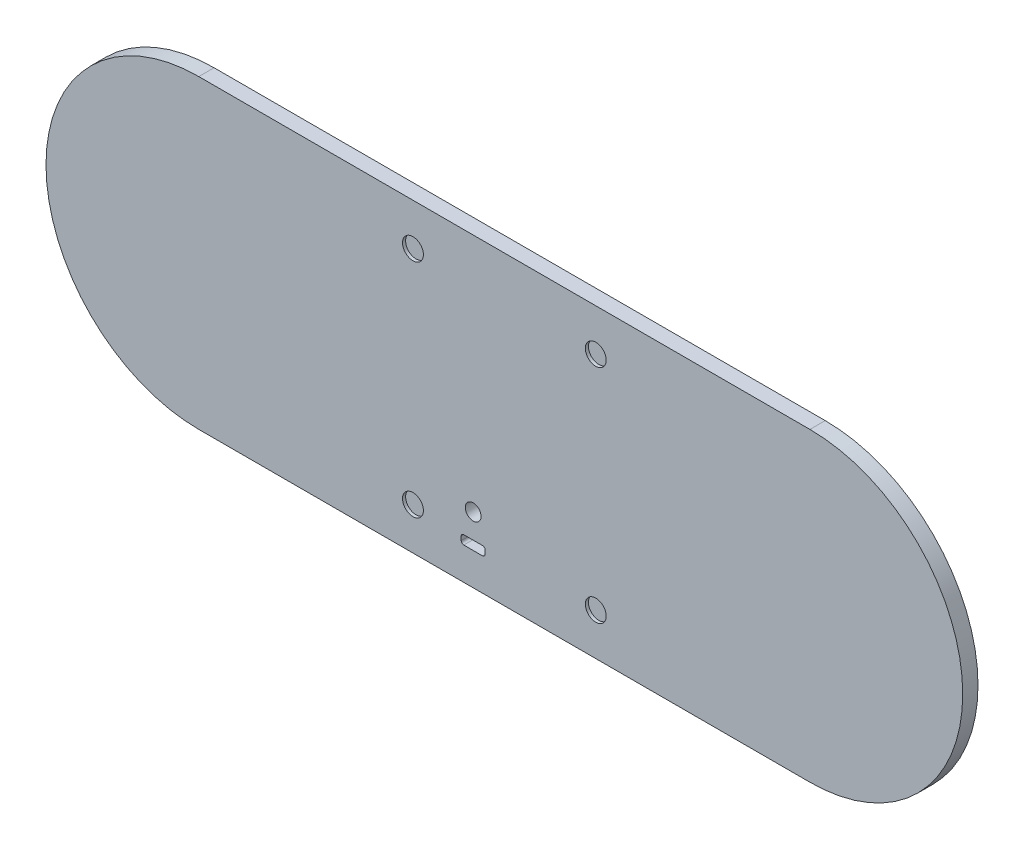
ISO-10303-21;
HEADER;
FILE_DESCRIPTION(('STEP AP214'),'2;1');
FILE_NAME('part.step','',(''),(''),'','','');
FILE_SCHEMA(('AUTOMOTIVE_DESIGN { 1 0 10303 214 1 1 1 1 }'));
ENDSEC;
DATA;
#1=APPLICATION_CONTEXT('core data for automotive mechanical design processes');
#2=APPLICATION_PROTOCOL_DEFINITION('international standard','automotive_design',2000,#1);
#3=PRODUCT_CONTEXT('',#1,'mechanical');
#4=PRODUCT('Part','Part','',(#3));
#5=PRODUCT_RELATED_PRODUCT_CATEGORY('part','',(#4));
#6=PRODUCT_DEFINITION_FORMATION('','',#4);
#7=PRODUCT_DEFINITION_CONTEXT('part definition',#1,'design');
#8=PRODUCT_DEFINITION('design','',#6,#7);
#9=PRODUCT_DEFINITION_SHAPE('','',#8);
#10=(LENGTH_UNIT() NAMED_UNIT(*) SI_UNIT(.MILLI.,.METRE.));
#11=(NAMED_UNIT(*) PLANE_ANGLE_UNIT() SI_UNIT($,.RADIAN.));
#12=(NAMED_UNIT(*) SI_UNIT($,.STERADIAN.) SOLID_ANGLE_UNIT());
#13=UNCERTAINTY_MEASURE_WITH_UNIT(LENGTH_MEASURE(1.E-05),#10,'distance_accuracy_value','');
#14=(GEOMETRIC_REPRESENTATION_CONTEXT(3) GLOBAL_UNCERTAINTY_ASSIGNED_CONTEXT((#13)) GLOBAL_UNIT_ASSIGNED_CONTEXT((#10,
#11,#12)) REPRESENTATION_CONTEXT('',''));
#15=CARTESIAN_POINT('',(0.,0.,0.));
#16=DIRECTION('',(0.,0.,1.));
#17=DIRECTION('',(1.,0.,0.));
#18=AXIS2_PLACEMENT_3D('',#15,#16,#17);
#19=CARTESIAN_POINT('',(120.,0.,6.));
#20=DIRECTION('',(0.,0.,-1.));
#21=DIRECTION('',(-1.,0.,0.));
#22=AXIS2_PLACEMENT_3D('',#19,#20,#21);
#23=CYLINDRICAL_SURFACE('',#22,60.);
#24=CARTESIAN_POINT('',(120.,0.,0.));
#25=DIRECTION('',(0.,0.,1.));
#26=DIRECTION('',(1.,0.,0.));
#27=AXIS2_PLACEMENT_3D('',#24,#25,#26);
#28=CIRCLE('',#27,60.);
#29=CARTESIAN_POINT('',(120.,-60.,0.));
#30=VERTEX_POINT('',#29);
#31=CARTESIAN_POINT('',(120.,60.,0.));
#32=VERTEX_POINT('',#31);
#33=EDGE_CURVE('E150',#30,#32,#28,.T.);
#34=ORIENTED_EDGE('',*,*,#33,.T.);
#35=DIRECTION('',(0.,0.,-1.));
#36=VECTOR('',#35,1.);
#37=CARTESIAN_POINT('',(120.,60.,6.));
#38=LINE('',#37,#36);
#39=CARTESIAN_POINT('',(120.,60.,6.));
#40=VERTEX_POINT('',#39);
#41=EDGE_CURVE('E131',#40,#32,#38,.T.);
#42=ORIENTED_EDGE('',*,*,#41,.F.);
#43=CARTESIAN_POINT('',(120.,0.,6.));
#44=DIRECTION('',(0.,0.,1.));
#45=DIRECTION('',(1.,0.,0.));
#46=AXIS2_PLACEMENT_3D('',#43,#44,#45);
#47=CIRCLE('',#46,60.);
#48=CARTESIAN_POINT('',(120.,-60.,6.));
#49=VERTEX_POINT('',#48);
#50=EDGE_CURVE('E138',#49,#40,#47,.T.);
#51=ORIENTED_EDGE('',*,*,#50,.F.);
#52=DIRECTION('',(0.,0.,-1.));
#53=VECTOR('',#52,1.);
#54=CARTESIAN_POINT('',(120.,-60.,6.));
#55=LINE('',#54,#53);
#56=EDGE_CURVE('E288',#49,#30,#55,.T.);
#57=ORIENTED_EDGE('',*,*,#56,.T.);
#58=EDGE_LOOP('',(#34,#42,#51,#57));
#59=FACE_BOUND('',#58,.T.);
#60=ADVANCED_FACE('F38',(#59),#23,.T.);
#61=CARTESIAN_POINT('',(120.,60.,6.));
#62=DIRECTION('',(0.,-1.,0.));
#63=DIRECTION('',(1.,0.,0.));
#64=AXIS2_PLACEMENT_3D('',#61,#62,#63);
#65=PLANE('',#64);
#66=DIRECTION('',(-1.,0.,0.));
#67=VECTOR('',#66,1.);
#68=CARTESIAN_POINT('',(120.,60.,0.));
#69=LINE('',#68,#67);
#70=CARTESIAN_POINT('',(-120.,60.,0.));
#71=VERTEX_POINT('',#70);
#72=EDGE_CURVE('E290',#32,#71,#69,.T.);
#73=ORIENTED_EDGE('',*,*,#72,.T.);
#74=DIRECTION('',(0.,0.,-1.));
#75=VECTOR('',#74,1.);
#76=CARTESIAN_POINT('',(-120.,60.,6.));
#77=LINE('',#76,#75);
#78=CARTESIAN_POINT('',(-120.,60.,6.));
#79=VERTEX_POINT('',#78);
#80=EDGE_CURVE('E134',#79,#71,#77,.T.);
#81=ORIENTED_EDGE('',*,*,#80,.F.);
#82=DIRECTION('',(-1.,0.,0.));
#83=VECTOR('',#82,1.);
#84=CARTESIAN_POINT('',(120.,60.,6.));
#85=LINE('',#84,#83);
#86=EDGE_CURVE('E127',#40,#79,#85,.T.);
#87=ORIENTED_EDGE('',*,*,#86,.F.);
#88=ORIENTED_EDGE('',*,*,#41,.T.);
#89=EDGE_LOOP('',(#73,#81,#87,#88));
#90=FACE_BOUND('',#89,.T.);
#91=ADVANCED_FACE('F129',(#90),#65,.F.);
#92=CARTESIAN_POINT('',(-120.,0.,6.));
#93=DIRECTION('',(0.,0.,-1.));
#94=DIRECTION('',(-1.,0.,0.));
#95=AXIS2_PLACEMENT_3D('',#92,#93,#94);
#96=CYLINDRICAL_SURFACE('',#95,60.);
#97=CARTESIAN_POINT('',(-120.,0.,0.));
#98=DIRECTION('',(0.,0.,1.));
#99=DIRECTION('',(1.,0.,0.));
#100=AXIS2_PLACEMENT_3D('',#97,#98,#99);
#101=CIRCLE('',#100,60.);
#102=CARTESIAN_POINT('',(-120.,-60.,0.));
#103=VERTEX_POINT('',#102);
#104=EDGE_CURVE('E292',#71,#103,#101,.T.);
#105=ORIENTED_EDGE('',*,*,#104,.T.);
#106=DIRECTION('',(0.,0.,-1.));
#107=VECTOR('',#106,1.);
#108=CARTESIAN_POINT('',(-120.,-60.,6.));
#109=LINE('',#108,#107);
#110=CARTESIAN_POINT('',(-120.,-60.,6.));
#111=VERTEX_POINT('',#110);
#112=EDGE_CURVE('E155',#111,#103,#109,.T.);
#113=ORIENTED_EDGE('',*,*,#112,.F.);
#114=CARTESIAN_POINT('',(-120.,0.,6.));
#115=DIRECTION('',(0.,0.,1.));
#116=DIRECTION('',(1.,0.,0.));
#117=AXIS2_PLACEMENT_3D('',#114,#115,#116);
#118=CIRCLE('',#117,60.);
#119=EDGE_CURVE('E137',#79,#111,#118,.T.);
#120=ORIENTED_EDGE('',*,*,#119,.F.);
#121=ORIENTED_EDGE('',*,*,#80,.T.);
#122=EDGE_LOOP('',(#105,#113,#120,#121));
#123=FACE_BOUND('',#122,.T.);
#124=ADVANCED_FACE('F219',(#123),#96,.T.);
#125=CARTESIAN_POINT('',(120.,-60.,6.));
#126=DIRECTION('',(0.,1.,0.));
#127=DIRECTION('',(-1.,0.,0.));
#128=AXIS2_PLACEMENT_3D('',#125,#126,#127);
#129=PLANE('',#128);
#130=DIRECTION('',(1.,0.,0.));
#131=VECTOR('',#130,1.);
#132=CARTESIAN_POINT('',(120.,-60.,0.));
#133=LINE('',#132,#131);
#134=EDGE_CURVE('E147',#103,#30,#133,.T.);
#135=ORIENTED_EDGE('',*,*,#134,.T.);
#136=ORIENTED_EDGE('',*,*,#56,.F.);
#137=DIRECTION('',(1.,0.,0.));
#138=VECTOR('',#137,1.);
#139=CARTESIAN_POINT('',(120.,-60.,6.));
#140=LINE('',#139,#138);
#141=EDGE_CURVE('E143',#111,#49,#140,.T.);
#142=ORIENTED_EDGE('',*,*,#141,.F.);
#143=ORIENTED_EDGE('',*,*,#112,.T.);
#144=EDGE_LOOP('',(#135,#136,#142,#143));
#145=FACE_BOUND('',#144,.T.);
#146=ADVANCED_FACE('F299',(#145),#129,.F.);
#147=CARTESIAN_POINT('',(120.,0.,6.));
#148=DIRECTION('',(0.,0.,1.));
#149=DIRECTION('',(1.,0.,0.));
#150=AXIS2_PLACEMENT_3D('',#147,#148,#149);
#151=PLANE('',#150);
#152=DIRECTION('',(0.,1.,0.));
#153=VECTOR('',#152,1.);
#154=CARTESIAN_POINT('',(-7.55000000000002,-47.29,6.));
#155=LINE('',#154,#153);
#156=CARTESIAN_POINT('',(-7.55000000000002,-46.29,6.));
#157=VERTEX_POINT('',#156);
#158=CARTESIAN_POINT('',(-7.55000000000002,-44.79,6.));
#159=VERTEX_POINT('',#158);
#160=EDGE_CURVE('E245',#157,#159,#155,.T.);
#161=ORIENTED_EDGE('',*,*,#160,.F.);
#162=CARTESIAN_POINT('',(-8.55000000000002,-46.29,6.));
#163=DIRECTION('',(0.,0.,1.));
#164=DIRECTION('',(1.,0.,0.));
#165=AXIS2_PLACEMENT_3D('',#162,#163,#164);
#166=CIRCLE('',#165,1.);
#167=CARTESIAN_POINT('',(-8.55000000000002,-47.29,6.));
#168=VERTEX_POINT('',#167);
#169=EDGE_CURVE('E179',#157,#168,#166,.F.);
#170=ORIENTED_EDGE('',*,*,#169,.T.);
#171=DIRECTION('',(1.,0.,0.));
#172=VECTOR('',#171,1.);
#173=CARTESIAN_POINT('',(-7.55000000000002,-47.29,6.));
#174=LINE('',#173,#172);
#175=CARTESIAN_POINT('',(-15.95,-47.29,6.));
#176=VERTEX_POINT('',#175);
#177=EDGE_CURVE('E201',#176,#168,#174,.T.);
#178=ORIENTED_EDGE('',*,*,#177,.F.);
#179=CARTESIAN_POINT('',(-15.95,-46.29,6.));
#180=DIRECTION('',(0.,0.,1.));
#181=DIRECTION('',(1.,0.,0.));
#182=AXIS2_PLACEMENT_3D('',#179,#180,#181);
#183=CIRCLE('',#182,1.);
#184=CARTESIAN_POINT('',(-16.95,-46.29,6.));
#185=VERTEX_POINT('',#184);
#186=EDGE_CURVE('E175',#176,#185,#183,.F.);
#187=ORIENTED_EDGE('',*,*,#186,.T.);
#188=DIRECTION('',(0.,-1.,0.));
#189=VECTOR('',#188,1.);
#190=CARTESIAN_POINT('',(-16.95,-47.29,6.));
#191=LINE('',#190,#189);
#192=CARTESIAN_POINT('',(-16.95,-44.79,6.));
#193=VERTEX_POINT('',#192);
#194=EDGE_CURVE('E253',#193,#185,#191,.T.);
#195=ORIENTED_EDGE('',*,*,#194,.F.);
#196=CARTESIAN_POINT('',(-15.95,-44.79,6.));
#197=DIRECTION('',(0.,0.,1.));
#198=DIRECTION('',(1.,0.,0.));
#199=AXIS2_PLACEMENT_3D('',#196,#197,#198);
#200=CIRCLE('',#199,1.);
#201=CARTESIAN_POINT('',(-15.95,-43.79,6.));
#202=VERTEX_POINT('',#201);
#203=EDGE_CURVE('E46',#193,#202,#200,.F.);
#204=ORIENTED_EDGE('',*,*,#203,.T.);
#205=DIRECTION('',(-1.,0.,0.));
#206=VECTOR('',#205,1.);
#207=CARTESIAN_POINT('',(-7.55000000000002,-43.79,6.));
#208=LINE('',#207,#206);
#209=CARTESIAN_POINT('',(-8.55000000000002,-43.79,6.));
#210=VERTEX_POINT('',#209);
#211=EDGE_CURVE('E251',#210,#202,#208,.T.);
#212=ORIENTED_EDGE('',*,*,#211,.F.);
#213=CARTESIAN_POINT('',(-8.55000000000002,-44.79,6.));
#214=DIRECTION('',(0.,0.,1.));
#215=DIRECTION('',(1.,0.,0.));
#216=AXIS2_PLACEMENT_3D('',#213,#214,#215);
#217=CIRCLE('',#216,1.);
#218=EDGE_CURVE('E60',#210,#159,#217,.F.);
#219=ORIENTED_EDGE('',*,*,#218,.T.);
#220=EDGE_LOOP('',(#161,#170,#178,#187,#195,#204,#212,#219));
#221=FACE_BOUND('',#220,.T.);
#222=CARTESIAN_POINT('',(-12.25,-34.1899999999999,6.));
#223=DIRECTION('',(0.,0.,1.));
#224=DIRECTION('',(1.,0.,0.));
#225=AXIS2_PLACEMENT_3D('',#222,#223,#224);
#226=CIRCLE('',#225,3.1);
#227=CARTESIAN_POINT('',(-15.35,-34.1899999999999,6.));
#228=VERTEX_POINT('',#227);
#229=EDGE_CURVE('E200',#228,#228,#226,.F.);
#230=ORIENTED_EDGE('',*,*,#229,.T.);
#231=EDGE_LOOP('',(#230));
#232=FACE_BOUND('',#231,.T.);
#233=CARTESIAN_POINT('',(-35.8939894755852,-43.5125389257834,6.));
#234=DIRECTION('',(0.,0.,1.));
#235=DIRECTION('',(1.,0.,0.));
#236=AXIS2_PLACEMENT_3D('',#233,#234,#235);
#237=CIRCLE('',#236,4.1);
#238=CARTESIAN_POINT('',(-31.7939894755852,-43.5125389257834,6.));
#239=VERTEX_POINT('',#238);
#240=EDGE_CURVE('E276',#239,#239,#237,.T.);
#241=ORIENTED_EDGE('',*,*,#240,.F.);
#242=EDGE_LOOP('',(#241));
#243=FACE_BOUND('',#242,.T.);
#244=CARTESIAN_POINT('',(35.8939894755852,-43.5125389257834,6.));
#245=DIRECTION('',(0.,0.,1.));
#246=DIRECTION('',(1.,0.,0.));
#247=AXIS2_PLACEMENT_3D('',#244,#245,#246);
#248=CIRCLE('',#247,4.1);
#249=CARTESIAN_POINT('',(39.9939894755852,-43.5125389257834,6.));
#250=VERTEX_POINT('',#249);
#251=EDGE_CURVE('E270',#250,#250,#248,.T.);
#252=ORIENTED_EDGE('',*,*,#251,.F.);
#253=EDGE_LOOP('',(#252));
#254=FACE_BOUND('',#253,.T.);
#255=CARTESIAN_POINT('',(35.8939894755852,43.5125389257834,6.));
#256=DIRECTION('',(0.,0.,1.));
#257=DIRECTION('',(1.,0.,0.));
#258=AXIS2_PLACEMENT_3D('',#255,#256,#257);
#259=CIRCLE('',#258,4.1);
#260=CARTESIAN_POINT('',(39.9939894755852,43.5125389257834,6.));
#261=VERTEX_POINT('',#260);
#262=EDGE_CURVE('E263',#261,#261,#259,.T.);
#263=ORIENTED_EDGE('',*,*,#262,.F.);
#264=EDGE_LOOP('',(#263));
#265=FACE_BOUND('',#264,.T.);
#266=CARTESIAN_POINT('',(-35.8939894755852,43.5125389257834,6.));
#267=DIRECTION('',(0.,0.,1.));
#268=DIRECTION('',(1.,0.,0.));
#269=AXIS2_PLACEMENT_3D('',#266,#267,#268);
#270=CIRCLE('',#269,4.1);
#271=CARTESIAN_POINT('',(-31.7939894755852,43.5125389257834,6.));
#272=VERTEX_POINT('',#271);
#273=EDGE_CURVE('E266',#272,#272,#270,.T.);
#274=ORIENTED_EDGE('',*,*,#273,.F.);
#275=EDGE_LOOP('',(#274));
#276=FACE_BOUND('',#275,.T.);
#277=ORIENTED_EDGE('',*,*,#50,.T.);
#278=ORIENTED_EDGE('',*,*,#86,.T.);
#279=ORIENTED_EDGE('',*,*,#119,.T.);
#280=ORIENTED_EDGE('',*,*,#141,.T.);
#281=EDGE_LOOP('',(#277,#278,#279,#280));
#282=FACE_BOUND('',#281,.T.);
#283=ADVANCED_FACE('F141',(#221,#232,#243,#254,#265,#276,#282),#151,.T.);
#284=CARTESIAN_POINT('',(120.,0.,0.));
#285=DIRECTION('',(0.,0.,1.));
#286=DIRECTION('',(1.,0.,0.));
#287=AXIS2_PLACEMENT_3D('',#284,#285,#286);
#288=PLANE('',#287);
#289=DIRECTION('',(-1.,0.,0.));
#290=VECTOR('',#289,1.);
#291=CARTESIAN_POINT('',(-7.55000000000002,-47.29,0.));
#292=LINE('',#291,#290);
#293=CARTESIAN_POINT('',(-8.55000000000002,-47.29,0.));
#294=VERTEX_POINT('',#293);
#295=CARTESIAN_POINT('',(-15.95,-47.29,0.));
#296=VERTEX_POINT('',#295);
#297=EDGE_CURVE('E235',#294,#296,#292,.T.);
#298=ORIENTED_EDGE('',*,*,#297,.F.);
#299=CARTESIAN_POINT('',(-8.55000000000002,-46.29,0.));
#300=DIRECTION('',(0.,0.,1.));
#301=DIRECTION('',(1.,0.,0.));
#302=AXIS2_PLACEMENT_3D('',#299,#300,#301);
#303=CIRCLE('',#302,1.);
#304=CARTESIAN_POINT('',(-7.55000000000002,-46.29,0.));
#305=VERTEX_POINT('',#304);
#306=EDGE_CURVE('E181',#294,#305,#303,.T.);
#307=ORIENTED_EDGE('',*,*,#306,.T.);
#308=DIRECTION('',(0.,-1.,0.));
#309=VECTOR('',#308,1.);
#310=CARTESIAN_POINT('',(-7.55000000000002,-47.29,0.));
#311=LINE('',#310,#309);
#312=CARTESIAN_POINT('',(-7.55000000000002,-44.79,0.));
#313=VERTEX_POINT('',#312);
#314=EDGE_CURVE('E196',#313,#305,#311,.T.);
#315=ORIENTED_EDGE('',*,*,#314,.F.);
#316=CARTESIAN_POINT('',(-8.55000000000002,-44.79,0.));
#317=DIRECTION('',(0.,0.,1.));
#318=DIRECTION('',(1.,0.,0.));
#319=AXIS2_PLACEMENT_3D('',#316,#317,#318);
#320=CIRCLE('',#319,1.);
#321=CARTESIAN_POINT('',(-8.55000000000002,-43.79,0.));
#322=VERTEX_POINT('',#321);
#323=EDGE_CURVE('E184',#313,#322,#320,.T.);
#324=ORIENTED_EDGE('',*,*,#323,.T.);
#325=DIRECTION('',(1.,0.,0.));
#326=VECTOR('',#325,1.);
#327=CARTESIAN_POINT('',(-7.55000000000002,-43.79,0.));
#328=LINE('',#327,#326);
#329=CARTESIAN_POINT('',(-15.95,-43.79,0.));
#330=VERTEX_POINT('',#329);
#331=EDGE_CURVE('E193',#330,#322,#328,.T.);
#332=ORIENTED_EDGE('',*,*,#331,.F.);
#333=CARTESIAN_POINT('',(-15.95,-44.79,0.));
#334=DIRECTION('',(0.,0.,1.));
#335=DIRECTION('',(1.,0.,0.));
#336=AXIS2_PLACEMENT_3D('',#333,#334,#335);
#337=CIRCLE('',#336,1.);
#338=CARTESIAN_POINT('',(-16.95,-44.79,0.));
#339=VERTEX_POINT('',#338);
#340=EDGE_CURVE('E11',#330,#339,#337,.T.);
#341=ORIENTED_EDGE('',*,*,#340,.T.);
#342=DIRECTION('',(0.,1.,0.));
#343=VECTOR('',#342,1.);
#344=CARTESIAN_POINT('',(-16.95,-47.29,0.));
#345=LINE('',#344,#343);
#346=CARTESIAN_POINT('',(-16.95,-46.29,0.));
#347=VERTEX_POINT('',#346);
#348=EDGE_CURVE('E238',#347,#339,#345,.T.);
#349=ORIENTED_EDGE('',*,*,#348,.F.);
#350=CARTESIAN_POINT('',(-15.95,-46.29,0.));
#351=DIRECTION('',(0.,0.,1.));
#352=DIRECTION('',(1.,0.,0.));
#353=AXIS2_PLACEMENT_3D('',#350,#351,#352);
#354=CIRCLE('',#353,1.);
#355=EDGE_CURVE('E177',#347,#296,#354,.T.);
#356=ORIENTED_EDGE('',*,*,#355,.T.);
#357=EDGE_LOOP('',(#298,#307,#315,#324,#332,#341,#349,#356));
#358=FACE_BOUND('',#357,.T.);
#359=CARTESIAN_POINT('',(-12.25,-34.1899999999999,0.));
#360=DIRECTION('',(0.,0.,-1.));
#361=DIRECTION('',(-1.,0.,0.));
#362=AXIS2_PLACEMENT_3D('',#359,#360,#361);
#363=CIRCLE('',#362,3.1);
#364=CARTESIAN_POINT('',(-15.35,-34.1899999999999,0.));
#365=VERTEX_POINT('',#364);
#366=EDGE_CURVE('E257',#365,#365,#363,.T.);
#367=ORIENTED_EDGE('',*,*,#366,.F.);
#368=EDGE_LOOP('',(#367));
#369=FACE_BOUND('',#368,.T.);
#370=ORIENTED_EDGE('',*,*,#33,.F.);
#371=ORIENTED_EDGE('',*,*,#134,.F.);
#372=ORIENTED_EDGE('',*,*,#104,.F.);
#373=ORIENTED_EDGE('',*,*,#72,.F.);
#374=EDGE_LOOP('',(#370,#371,#372,#373));
#375=FACE_BOUND('',#374,.T.);
#376=ADVANCED_FACE('F191',(#358,#369,#375),#288,.F.);
#377=CARTESIAN_POINT('',(-35.8939894755852,43.5125389257834,4.78));
#378=DIRECTION('',(0.,0.,1.));
#379=DIRECTION('',(1.,0.,0.));
#380=AXIS2_PLACEMENT_3D('',#377,#378,#379);
#381=CYLINDRICAL_SURFACE('',#380,4.1);
#382=CARTESIAN_POINT('',(-35.8939894755852,43.5125389257834,4.78));
#383=DIRECTION('',(0.,0.,1.));
#384=DIRECTION('',(1.,0.,0.));
#385=AXIS2_PLACEMENT_3D('',#382,#383,#384);
#386=CIRCLE('',#385,4.1);
#387=CARTESIAN_POINT('',(-31.7939894755852,43.5125389257834,4.78));
#388=VERTEX_POINT('',#387);
#389=EDGE_CURVE('E281',#388,#388,#386,.T.);
#390=ORIENTED_EDGE('',*,*,#389,.F.);
#391=EDGE_LOOP('',(#390));
#392=FACE_BOUND('',#391,.T.);
#393=ORIENTED_EDGE('',*,*,#273,.T.);
#394=EDGE_LOOP('',(#393));
#395=FACE_BOUND('',#394,.T.);
#396=ADVANCED_FACE('F311',(#392,#395),#381,.F.);
#397=CARTESIAN_POINT('',(-35.8939894755852,43.5125389257834,4.78));
#398=DIRECTION('',(0.,0.,1.));
#399=DIRECTION('',(1.,0.,0.));
#400=AXIS2_PLACEMENT_3D('',#397,#398,#399);
#401=PLANE('',#400);
#402=ORIENTED_EDGE('',*,*,#389,.T.);
#403=EDGE_LOOP('',(#402));
#404=FACE_BOUND('',#403,.T.);
#405=ADVANCED_FACE('F316',(#404),#401,.T.);
#406=CARTESIAN_POINT('',(35.8939894755852,43.5125389257834,4.78));
#407=DIRECTION('',(0.,0.,1.));
#408=DIRECTION('',(1.,0.,0.));
#409=AXIS2_PLACEMENT_3D('',#406,#407,#408);
#410=CYLINDRICAL_SURFACE('',#409,4.1);
#411=CARTESIAN_POINT('',(35.8939894755852,43.5125389257834,4.78));
#412=DIRECTION('',(0.,0.,1.));
#413=DIRECTION('',(1.,0.,0.));
#414=AXIS2_PLACEMENT_3D('',#411,#412,#413);
#415=CIRCLE('',#414,4.1);
#416=CARTESIAN_POINT('',(39.9939894755852,43.5125389257834,4.78));
#417=VERTEX_POINT('',#416);
#418=EDGE_CURVE('E267',#417,#417,#415,.T.);
#419=ORIENTED_EDGE('',*,*,#418,.F.);
#420=EDGE_LOOP('',(#419));
#421=FACE_BOUND('',#420,.T.);
#422=ORIENTED_EDGE('',*,*,#262,.T.);
#423=EDGE_LOOP('',(#422));
#424=FACE_BOUND('',#423,.T.);
#425=ADVANCED_FACE('F320',(#421,#424),#410,.F.);
#426=CARTESIAN_POINT('',(35.8939894755852,43.5125389257834,4.78));
#427=DIRECTION('',(0.,0.,1.));
#428=DIRECTION('',(1.,0.,0.));
#429=AXIS2_PLACEMENT_3D('',#426,#427,#428);
#430=PLANE('',#429);
#431=ORIENTED_EDGE('',*,*,#418,.T.);
#432=EDGE_LOOP('',(#431));
#433=FACE_BOUND('',#432,.T.);
#434=ADVANCED_FACE('F338',(#433),#430,.T.);
#435=CARTESIAN_POINT('',(35.8939894755852,-43.5125389257834,4.78));
#436=DIRECTION('',(0.,0.,1.));
#437=DIRECTION('',(1.,0.,0.));
#438=AXIS2_PLACEMENT_3D('',#435,#436,#437);
#439=CYLINDRICAL_SURFACE('',#438,4.1);
#440=CARTESIAN_POINT('',(35.8939894755852,-43.5125389257834,4.78));
#441=DIRECTION('',(0.,0.,1.));
#442=DIRECTION('',(1.,0.,0.));
#443=AXIS2_PLACEMENT_3D('',#440,#441,#442);
#444=CIRCLE('',#443,4.1);
#445=CARTESIAN_POINT('',(39.9939894755852,-43.5125389257834,4.78));
#446=VERTEX_POINT('',#445);
#447=EDGE_CURVE('E273',#446,#446,#444,.T.);
#448=ORIENTED_EDGE('',*,*,#447,.F.);
#449=EDGE_LOOP('',(#448));
#450=FACE_BOUND('',#449,.T.);
#451=ORIENTED_EDGE('',*,*,#251,.T.);
#452=EDGE_LOOP('',(#451));
#453=FACE_BOUND('',#452,.T.);
#454=ADVANCED_FACE('F334',(#450,#453),#439,.F.);
#455=CARTESIAN_POINT('',(35.8939894755852,-43.5125389257834,4.78));
#456=DIRECTION('',(0.,0.,1.));
#457=DIRECTION('',(1.,0.,0.));
#458=AXIS2_PLACEMENT_3D('',#455,#456,#457);
#459=PLANE('',#458);
#460=ORIENTED_EDGE('',*,*,#447,.T.);
#461=EDGE_LOOP('',(#460));
#462=FACE_BOUND('',#461,.T.);
#463=ADVANCED_FACE('F330',(#462),#459,.T.);
#464=CARTESIAN_POINT('',(-35.8939894755852,-43.5125389257834,4.78));
#465=DIRECTION('',(0.,0.,1.));
#466=DIRECTION('',(1.,0.,0.));
#467=AXIS2_PLACEMENT_3D('',#464,#465,#466);
#468=CYLINDRICAL_SURFACE('',#467,4.1);
#469=CARTESIAN_POINT('',(-35.8939894755852,-43.5125389257834,4.78));
#470=DIRECTION('',(0.,0.,1.));
#471=DIRECTION('',(1.,0.,0.));
#472=AXIS2_PLACEMENT_3D('',#469,#470,#471);
#473=CIRCLE('',#472,4.1);
#474=CARTESIAN_POINT('',(-31.7939894755852,-43.5125389257834,4.78));
#475=VERTEX_POINT('',#474);
#476=EDGE_CURVE('E260',#475,#475,#473,.T.);
#477=ORIENTED_EDGE('',*,*,#476,.F.);
#478=EDGE_LOOP('',(#477));
#479=FACE_BOUND('',#478,.T.);
#480=ORIENTED_EDGE('',*,*,#240,.T.);
#481=EDGE_LOOP('',(#480));
#482=FACE_BOUND('',#481,.T.);
#483=ADVANCED_FACE('F326',(#479,#482),#468,.F.);
#484=CARTESIAN_POINT('',(-35.8939894755852,-43.5125389257834,4.78));
#485=DIRECTION('',(0.,0.,1.));
#486=DIRECTION('',(1.,0.,0.));
#487=AXIS2_PLACEMENT_3D('',#484,#485,#486);
#488=PLANE('',#487);
#489=ORIENTED_EDGE('',*,*,#476,.T.);
#490=EDGE_LOOP('',(#489));
#491=FACE_BOUND('',#490,.T.);
#492=ADVANCED_FACE('F322',(#491),#488,.T.);
#493=CARTESIAN_POINT('',(-12.25,-34.1899999999999,6.001));
#494=DIRECTION('',(0.,0.,-1.));
#495=DIRECTION('',(-1.,0.,0.));
#496=AXIS2_PLACEMENT_3D('',#493,#494,#495);
#497=CYLINDRICAL_SURFACE('',#496,3.1);
#498=CARTESIAN_POINT('',(-15.35,-34.1899999999999,6.));
#499=CARTESIAN_POINT('',(-15.35,-34.1899999999999,5.9375));
#500=CARTESIAN_POINT('',(-15.35,-34.1899999999999,5.875));
#501=CARTESIAN_POINT('',(-15.35,-34.1899999999999,5.75));
#502=CARTESIAN_POINT('',(-15.35,-34.1899999999999,5.6875));
#503=CARTESIAN_POINT('',(-15.35,-34.1899999999999,5.5625));
#504=CARTESIAN_POINT('',(-15.35,-34.1899999999999,5.5));
#505=CARTESIAN_POINT('',(-15.35,-34.1899999999999,5.375));
#506=CARTESIAN_POINT('',(-15.35,-34.1899999999999,5.3125));
#507=CARTESIAN_POINT('',(-15.35,-34.1899999999999,5.1875));
#508=CARTESIAN_POINT('',(-15.35,-34.1899999999999,5.125));
#509=CARTESIAN_POINT('',(-15.35,-34.1899999999999,5.));
#510=CARTESIAN_POINT('',(-15.35,-34.1899999999999,4.9375));
#511=CARTESIAN_POINT('',(-15.35,-34.1899999999999,4.8125));
#512=CARTESIAN_POINT('',(-15.35,-34.1899999999999,4.75));
#513=CARTESIAN_POINT('',(-15.35,-34.1899999999999,4.625));
#514=CARTESIAN_POINT('',(-15.35,-34.1899999999999,4.5625));
#515=CARTESIAN_POINT('',(-15.35,-34.1899999999999,4.4375));
#516=CARTESIAN_POINT('',(-15.35,-34.1899999999999,4.375));
#517=CARTESIAN_POINT('',(-15.35,-34.1899999999999,4.25));
#518=CARTESIAN_POINT('',(-15.35,-34.1899999999999,4.1875));
#519=CARTESIAN_POINT('',(-15.35,-34.1899999999999,4.0625));
#520=CARTESIAN_POINT('',(-15.35,-34.1899999999999,4.));
#521=CARTESIAN_POINT('',(-15.35,-34.1899999999999,3.875));
#522=CARTESIAN_POINT('',(-15.35,-34.1899999999999,3.8125));
#523=CARTESIAN_POINT('',(-15.35,-34.1899999999999,3.6875));
#524=CARTESIAN_POINT('',(-15.35,-34.1899999999999,3.625));
#525=CARTESIAN_POINT('',(-15.35,-34.1899999999999,3.5));
#526=CARTESIAN_POINT('',(-15.35,-34.1899999999999,3.4375));
#527=CARTESIAN_POINT('',(-15.35,-34.1899999999999,3.3125));
#528=CARTESIAN_POINT('',(-15.35,-34.1899999999999,3.25));
#529=CARTESIAN_POINT('',(-15.35,-34.1899999999999,3.125));
#530=CARTESIAN_POINT('',(-15.35,-34.1899999999999,3.0625));
#531=CARTESIAN_POINT('',(-15.35,-34.1899999999999,2.9375));
#532=CARTESIAN_POINT('',(-15.35,-34.1899999999999,2.875));
#533=CARTESIAN_POINT('',(-15.35,-34.1899999999999,2.75));
#534=CARTESIAN_POINT('',(-15.35,-34.1899999999999,2.6875));
#535=CARTESIAN_POINT('',(-15.35,-34.1899999999999,2.5625));
#536=CARTESIAN_POINT('',(-15.35,-34.1899999999999,2.5));
#537=CARTESIAN_POINT('',(-15.35,-34.1899999999999,2.375));
#538=CARTESIAN_POINT('',(-15.35,-34.1899999999999,2.3125));
#539=CARTESIAN_POINT('',(-15.35,-34.1899999999999,2.1875));
#540=CARTESIAN_POINT('',(-15.35,-34.1899999999999,2.125));
#541=CARTESIAN_POINT('',(-15.35,-34.1899999999999,2.));
#542=CARTESIAN_POINT('',(-15.35,-34.1899999999999,1.9375));
#543=CARTESIAN_POINT('',(-15.35,-34.1899999999999,1.8125));
#544=CARTESIAN_POINT('',(-15.35,-34.1899999999999,1.75));
#545=CARTESIAN_POINT('',(-15.35,-34.1899999999999,1.625));
#546=CARTESIAN_POINT('',(-15.35,-34.1899999999999,1.5625));
#547=CARTESIAN_POINT('',(-15.35,-34.1899999999999,1.4375));
#548=CARTESIAN_POINT('',(-15.35,-34.1899999999999,1.375));
#549=CARTESIAN_POINT('',(-15.35,-34.1899999999999,1.25));
#550=CARTESIAN_POINT('',(-15.35,-34.1899999999999,1.1875));
#551=CARTESIAN_POINT('',(-15.35,-34.1899999999999,1.0625));
#552=CARTESIAN_POINT('',(-15.35,-34.1899999999999,1.));
#553=CARTESIAN_POINT('',(-15.35,-34.1899999999999,0.875));
#554=CARTESIAN_POINT('',(-15.35,-34.1899999999999,0.8125));
#555=CARTESIAN_POINT('',(-15.35,-34.1899999999999,0.6875));
#556=CARTESIAN_POINT('',(-15.35,-34.1899999999999,0.625));
#557=CARTESIAN_POINT('',(-15.35,-34.1899999999999,0.5));
#558=CARTESIAN_POINT('',(-15.35,-34.1899999999999,0.4375));
#559=CARTESIAN_POINT('',(-15.35,-34.1899999999999,0.3125));
#560=CARTESIAN_POINT('',(-15.35,-34.1899999999999,0.25));
#561=CARTESIAN_POINT('',(-15.35,-34.1899999999999,0.125));
#562=CARTESIAN_POINT('',(-15.35,-34.1899999999999,0.0625000000000001));
#563=CARTESIAN_POINT('',(-15.35,-34.1899999999999,0.));
#564=B_SPLINE_CURVE_WITH_KNOTS('',3,(#498,#499,#500,#501,#502,#503,#504,#505,#506,#507,#508,
#509,#510,#511,#512,#513,#514,#515,#516,#517,#518,#519,#520,#521,#522,#523,#524,#525,#526,#527,
#528,#529,#530,#531,#532,#533,#534,#535,#536,#537,#538,#539,#540,#541,#542,#543,#544,#545,#546,
#547,#548,#549,#550,#551,#552,#553,#554,#555,#556,#557,#558,#559,#560,#561,#562,#563),
.UNSPECIFIED.,.F.,.F.,(4,2,2,2,2,2,2,2,2,2,2,2,2,2,2,2,2,2,2,2,2,2,2,2,2,2,2,2,2,2,2,2,4),(0.,
0.187499999999999,0.374999999999999,0.5625,0.75,0.937499999999999,1.125,1.3125,1.5,1.6875,1.875,
2.0625,2.25,2.4375,2.625,2.8125,3.,3.1875,3.375,3.5625,3.75,3.9375,4.125,4.3125,4.5,4.6875,
4.875,5.0625,5.25,5.4375,5.625,5.8125,6.),.UNSPECIFIED.);
#565=EDGE_CURVE('BSEAM325',#228,#365,#564,.T.);
#566=ORIENTED_EDGE('',*,*,#229,.F.);
#567=ORIENTED_EDGE('',*,*,#366,.T.);
#568=ORIENTED_EDGE('',*,*,#565,.T.);
#569=ORIENTED_EDGE('',*,*,#565,.F.);
#570=EDGE_LOOP('',(#566,#568,#567,#569));
#571=FACE_BOUND('',#570,.T.);
#572=ADVANCED_FACE('F325',(#571),#497,.F.);
#573=CARTESIAN_POINT('',(-7.55000000000002,-47.29,-0.00100000000000013));
#574=DIRECTION('',(1.,0.,0.));
#575=DIRECTION('',(0.,0.,-1.));
#576=AXIS2_PLACEMENT_3D('',#573,#574,#575);
#577=PLANE('',#576);
#578=ORIENTED_EDGE('',*,*,#314,.T.);
#579=DIRECTION('',(0.,0.,1.));
#580=VECTOR('',#579,1.);
#581=CARTESIAN_POINT('',(-7.55000000000002,-46.29,6.));
#582=LINE('',#581,#580);
#583=EDGE_CURVE('E168',#305,#157,#582,.T.);
#584=ORIENTED_EDGE('',*,*,#583,.T.);
#585=ORIENTED_EDGE('',*,*,#160,.T.);
#586=DIRECTION('',(0.,0.,1.));
#587=VECTOR('',#586,1.);
#588=CARTESIAN_POINT('',(-7.55000000000002,-44.79,0.));
#589=LINE('',#588,#587);
#590=EDGE_CURVE('E166',#159,#313,#589,.F.);
#591=ORIENTED_EDGE('',*,*,#590,.T.);
#592=EDGE_LOOP('',(#578,#584,#585,#591));
#593=FACE_BOUND('',#592,.T.);
#594=ADVANCED_FACE('F348',(#593),#577,.F.);
#595=CARTESIAN_POINT('',(-7.55000000000002,-47.29,-0.00100000000000013));
#596=DIRECTION('',(0.,-1.,0.));
#597=DIRECTION('',(0.,0.,-1.));
#598=AXIS2_PLACEMENT_3D('',#595,#596,#597);
#599=PLANE('',#598);
#600=ORIENTED_EDGE('',*,*,#297,.T.);
#601=DIRECTION('',(0.,0.,1.));
#602=VECTOR('',#601,1.);
#603=CARTESIAN_POINT('',(-15.95,-47.29,6.));
#604=LINE('',#603,#602);
#605=EDGE_CURVE('E153',#296,#176,#604,.T.);
#606=ORIENTED_EDGE('',*,*,#605,.T.);
#607=ORIENTED_EDGE('',*,*,#177,.T.);
#608=DIRECTION('',(0.,0.,1.));
#609=VECTOR('',#608,1.);
#610=CARTESIAN_POINT('',(-8.55000000000002,-47.29,0.));
#611=LINE('',#610,#609);
#612=EDGE_CURVE('E151',#168,#294,#611,.F.);
#613=ORIENTED_EDGE('',*,*,#612,.T.);
#614=EDGE_LOOP('',(#600,#606,#607,#613));
#615=FACE_BOUND('',#614,.T.);
#616=ADVANCED_FACE('F240',(#615),#599,.F.);
#617=CARTESIAN_POINT('',(-16.95,-47.29,-0.00100000000000013));
#618=DIRECTION('',(-1.,0.,0.));
#619=DIRECTION('',(0.,0.,1.));
#620=AXIS2_PLACEMENT_3D('',#617,#618,#619);
#621=PLANE('',#620);
#622=ORIENTED_EDGE('',*,*,#194,.T.);
#623=DIRECTION('',(0.,0.,1.));
#624=VECTOR('',#623,1.);
#625=CARTESIAN_POINT('',(-16.95,-46.29,0.));
#626=LINE('',#625,#624);
#627=EDGE_CURVE('E164',#185,#347,#626,.F.);
#628=ORIENTED_EDGE('',*,*,#627,.T.);
#629=ORIENTED_EDGE('',*,*,#348,.T.);
#630=DIRECTION('',(0.,0.,1.));
#631=VECTOR('',#630,1.);
#632=CARTESIAN_POINT('',(-16.95,-44.79,6.));
#633=LINE('',#632,#631);
#634=EDGE_CURVE('E161',#339,#193,#633,.T.);
#635=ORIENTED_EDGE('',*,*,#634,.T.);
#636=EDGE_LOOP('',(#622,#628,#629,#635));
#637=FACE_BOUND('',#636,.T.);
#638=ADVANCED_FACE('F228',(#637),#621,.F.);
#639=CARTESIAN_POINT('',(-7.55000000000002,-43.79,-0.00100000000000013));
#640=DIRECTION('',(0.,1.,0.));
#641=DIRECTION('',(0.,0.,1.));
#642=AXIS2_PLACEMENT_3D('',#639,#640,#641);
#643=PLANE('',#642);
#644=ORIENTED_EDGE('',*,*,#331,.T.);
#645=DIRECTION('',(0.,0.,1.));
#646=VECTOR('',#645,1.);
#647=CARTESIAN_POINT('',(-8.55000000000002,-43.79,6.));
#648=LINE('',#647,#646);
#649=EDGE_CURVE('E173',#322,#210,#648,.T.);
#650=ORIENTED_EDGE('',*,*,#649,.T.);
#651=ORIENTED_EDGE('',*,*,#211,.T.);
#652=DIRECTION('',(0.,0.,1.));
#653=VECTOR('',#652,1.);
#654=CARTESIAN_POINT('',(-15.95,-43.79,0.));
#655=LINE('',#654,#653);
#656=EDGE_CURVE('E171',#202,#330,#655,.F.);
#657=ORIENTED_EDGE('',*,*,#656,.T.);
#658=EDGE_LOOP('',(#644,#650,#651,#657));
#659=FACE_BOUND('',#658,.T.);
#660=ADVANCED_FACE('F198',(#659),#643,.F.);
#661=CARTESIAN_POINT('',(-15.95,-46.29,-0.00100000000000013));
#662=DIRECTION('',(0.,0.,-1.));
#663=DIRECTION('',(-1.,0.,0.));
#664=AXIS2_PLACEMENT_3D('',#661,#662,#663);
#665=CYLINDRICAL_SURFACE('',#664,1.);
#666=ORIENTED_EDGE('',*,*,#355,.F.);
#667=ORIENTED_EDGE('',*,*,#627,.F.);
#668=ORIENTED_EDGE('',*,*,#186,.F.);
#669=ORIENTED_EDGE('',*,*,#605,.F.);
#670=EDGE_LOOP('',(#666,#667,#668,#669));
#671=FACE_BOUND('',#670,.T.);
#672=ADVANCED_FACE('F211',(#671),#665,.F.);
#673=CARTESIAN_POINT('',(-8.55000000000002,-46.29,-0.00100000000000013));
#674=DIRECTION('',(0.,0.,-1.));
#675=DIRECTION('',(-1.,0.,0.));
#676=AXIS2_PLACEMENT_3D('',#673,#674,#675);
#677=CYLINDRICAL_SURFACE('',#676,1.);
#678=ORIENTED_EDGE('',*,*,#306,.F.);
#679=ORIENTED_EDGE('',*,*,#612,.F.);
#680=ORIENTED_EDGE('',*,*,#169,.F.);
#681=ORIENTED_EDGE('',*,*,#583,.F.);
#682=EDGE_LOOP('',(#678,#679,#680,#681));
#683=FACE_BOUND('',#682,.T.);
#684=ADVANCED_FACE('F205',(#683),#677,.F.);
#685=CARTESIAN_POINT('',(-8.55000000000002,-44.79,-0.00100000000000013));
#686=DIRECTION('',(0.,0.,-1.));
#687=DIRECTION('',(-1.,0.,0.));
#688=AXIS2_PLACEMENT_3D('',#685,#686,#687);
#689=CYLINDRICAL_SURFACE('',#688,1.);
#690=ORIENTED_EDGE('',*,*,#323,.F.);
#691=ORIENTED_EDGE('',*,*,#590,.F.);
#692=ORIENTED_EDGE('',*,*,#218,.F.);
#693=ORIENTED_EDGE('',*,*,#649,.F.);
#694=EDGE_LOOP('',(#690,#691,#692,#693));
#695=FACE_BOUND('',#694,.T.);
#696=ADVANCED_FACE('F203',(#695),#689,.F.);
#697=CARTESIAN_POINT('',(-15.95,-44.79,-0.00100000000000013));
#698=DIRECTION('',(0.,0.,-1.));
#699=DIRECTION('',(-1.,0.,0.));
#700=AXIS2_PLACEMENT_3D('',#697,#698,#699);
#701=CYLINDRICAL_SURFACE('',#700,1.);
#702=ORIENTED_EDGE('',*,*,#340,.F.);
#703=ORIENTED_EDGE('',*,*,#656,.F.);
#704=ORIENTED_EDGE('',*,*,#203,.F.);
#705=ORIENTED_EDGE('',*,*,#634,.F.);
#706=EDGE_LOOP('',(#702,#703,#704,#705));
#707=FACE_BOUND('',#706,.T.);
#708=ADVANCED_FACE('F40',(#707),#701,.F.);
#709=CLOSED_SHELL('',(#60,#91,#124,#146,#283,#376,#396,#405,#425,#434,#454,#463,#483,#492,#572,
#594,#616,#638,#660,#672,#684,#696,#708));
#710=MANIFOLD_SOLID_BREP('B2',#709);
#711=ADVANCED_BREP_SHAPE_REPRESENTATION('',(#18,#710),#14);
#712=SHAPE_DEFINITION_REPRESENTATION(#9,#711);
ENDSEC;
END-ISO-10303-21;
